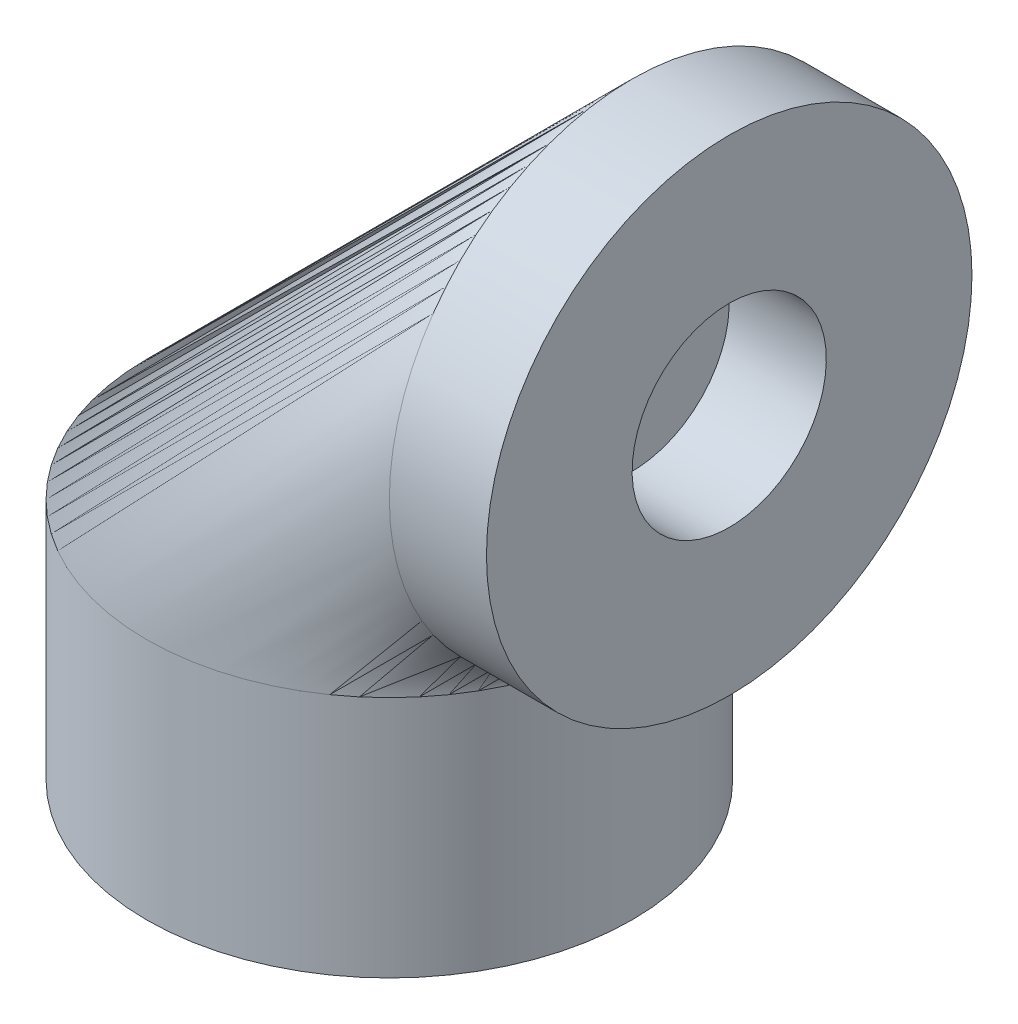
ISO-10303-21;
HEADER;
FILE_DESCRIPTION(('STEP AP214'),'2;1');
FILE_NAME('part.step','',(''),(''),'','','');
FILE_SCHEMA(('AUTOMOTIVE_DESIGN { 1 0 10303 214 1 1 1 1 }'));
ENDSEC;
DATA;
#1=APPLICATION_CONTEXT('core data for automotive mechanical design processes');
#2=APPLICATION_PROTOCOL_DEFINITION('international standard','automotive_design',2000,#1);
#3=PRODUCT_CONTEXT('',#1,'mechanical');
#4=PRODUCT('Part','Part','',(#3));
#5=PRODUCT_RELATED_PRODUCT_CATEGORY('part','',(#4));
#6=PRODUCT_DEFINITION_FORMATION('','',#4);
#7=PRODUCT_DEFINITION_CONTEXT('part definition',#1,'design');
#8=PRODUCT_DEFINITION('design','',#6,#7);
#9=PRODUCT_DEFINITION_SHAPE('','',#8);
#10=(LENGTH_UNIT() NAMED_UNIT(*) SI_UNIT(.MILLI.,.METRE.));
#11=(NAMED_UNIT(*) PLANE_ANGLE_UNIT() SI_UNIT($,.RADIAN.));
#12=(NAMED_UNIT(*) SI_UNIT($,.STERADIAN.) SOLID_ANGLE_UNIT());
#13=UNCERTAINTY_MEASURE_WITH_UNIT(LENGTH_MEASURE(1.E-05),#10,'distance_accuracy_value','');
#14=(GEOMETRIC_REPRESENTATION_CONTEXT(3) GLOBAL_UNCERTAINTY_ASSIGNED_CONTEXT((#13)) GLOBAL_UNIT_ASSIGNED_CONTEXT((#10,
#11,#12)) REPRESENTATION_CONTEXT('',''));
#15=CARTESIAN_POINT('',(0.,0.,0.));
#16=DIRECTION('',(0.,0.,1.));
#17=DIRECTION('',(1.,0.,0.));
#18=AXIS2_PLACEMENT_3D('',#15,#16,#17);
#19=CARTESIAN_POINT('',(0.,50.,0.));
#20=DIRECTION('',(0.,-1.,0.));
#21=DIRECTION('',(0.,0.,-1.));
#22=AXIS2_PLACEMENT_3D('',#19,#20,#21);
#23=CYLINDRICAL_SURFACE('',#22,50.);
#24=CARTESIAN_POINT('',(0.,50.,0.));
#25=DIRECTION('',(0.,1.,0.));
#26=DIRECTION('',(0.,0.,1.));
#27=AXIS2_PLACEMENT_3D('',#24,#25,#26);
#28=CIRCLE('',#27,50.);
#29=CARTESIAN_POINT('',(50.,50.,0.));
#30=VERTEX_POINT('',#29);
#31=EDGE_CURVE('E42',#30,#30,#28,.T.);
#32=ORIENTED_EDGE('',*,*,#31,.F.);
#33=EDGE_LOOP('',(#32));
#34=FACE_BOUND('',#33,.T.);
#35=CARTESIAN_POINT('',(0.,0.,0.));
#36=DIRECTION('',(0.,1.,0.));
#37=DIRECTION('',(0.,0.,1.));
#38=AXIS2_PLACEMENT_3D('',#35,#36,#37);
#39=CIRCLE('',#38,50.);
#40=CARTESIAN_POINT('',(0.,0.,50.));
#41=VERTEX_POINT('',#40);
#42=EDGE_CURVE('E52',#41,#41,#39,.T.);
#43=ORIENTED_EDGE('',*,*,#42,.T.);
#44=EDGE_LOOP('',(#43));
#45=FACE_BOUND('',#44,.T.);
#46=ADVANCED_FACE('F35',(#34,#45),#23,.T.);
#47=CARTESIAN_POINT('',(0.,0.,0.));
#48=DIRECTION('',(0.,1.,0.));
#49=DIRECTION('',(0.,0.,1.));
#50=AXIS2_PLACEMENT_3D('',#47,#48,#49);
#51=PLANE('',#50);
#52=CARTESIAN_POINT('',(0.,0.,0.));
#53=DIRECTION('',(0.,-1.,0.));
#54=DIRECTION('',(0.,0.,-1.));
#55=AXIS2_PLACEMENT_3D('',#52,#53,#54);
#56=CIRCLE('',#55,20.);
#57=CARTESIAN_POINT('',(0.,0.,-20.));
#58=VERTEX_POINT('',#57);
#59=EDGE_CURVE('E11',#58,#58,#56,.T.);
#60=ORIENTED_EDGE('',*,*,#59,.F.);
#61=EDGE_LOOP('',(#60));
#62=FACE_BOUND('',#61,.T.);
#63=ORIENTED_EDGE('',*,*,#42,.F.);
#64=EDGE_LOOP('',(#63));
#65=FACE_BOUND('',#64,.T.);
#66=ADVANCED_FACE('F83',(#62,#65),#51,.F.);
#67=CARTESIAN_POINT('',(50.,50.,0.));
#68=DIRECTION('',(0.,0.,1.));
#69=DIRECTION('',(1.,0.,0.));
#70=AXIS2_PLACEMENT_3D('',#67,#68,#69);
#71=DEGENERATE_TOROIDAL_SURFACE('',#70,50.,50.,.T.);
#72=ORIENTED_EDGE('',*,*,#31,.T.);
#73=CARTESIAN_POINT('',(50.,100.,0.));
#74=DIRECTION('',(1.,0.,0.));
#75=DIRECTION('',(0.,0.,1.));
#76=AXIS2_PLACEMENT_3D('',#73,#74,#75);
#77=CIRCLE('',#76,50.);
#78=EDGE_CURVE('E47',#30,#30,#77,.T.);
#79=ORIENTED_EDGE('',*,*,#78,.F.);
#80=EDGE_LOOP('',(#72,#79));
#81=FACE_BOUND('',#80,.T.);
#82=ADVANCED_FACE('F86',(#81),#71,.T.);
#83=CARTESIAN_POINT('',(70.,100.,0.));
#84=DIRECTION('',(-1.,0.,0.));
#85=DIRECTION('',(0.,-1.,0.));
#86=AXIS2_PLACEMENT_3D('',#83,#84,#85);
#87=CYLINDRICAL_SURFACE('',#86,50.);
#88=CARTESIAN_POINT('',(70.,100.,0.));
#89=DIRECTION('',(1.,0.,0.));
#90=DIRECTION('',(0.,1.,0.));
#91=AXIS2_PLACEMENT_3D('',#88,#89,#90);
#92=CIRCLE('',#91,50.);
#93=CARTESIAN_POINT('',(70.,150.,0.));
#94=VERTEX_POINT('',#93);
#95=EDGE_CURVE('E53',#94,#94,#92,.T.);
#96=ORIENTED_EDGE('',*,*,#95,.F.);
#97=EDGE_LOOP('',(#96));
#98=FACE_BOUND('',#97,.T.);
#99=ORIENTED_EDGE('',*,*,#78,.T.);
#100=EDGE_LOOP('',(#99));
#101=FACE_BOUND('',#100,.T.);
#102=ADVANCED_FACE('F49',(#98,#101),#87,.T.);
#103=CARTESIAN_POINT('',(70.,100.,0.));
#104=DIRECTION('',(1.,0.,0.));
#105=DIRECTION('',(0.,1.,0.));
#106=AXIS2_PLACEMENT_3D('',#103,#104,#105);
#107=PLANE('',#106);
#108=CARTESIAN_POINT('',(70.,100.,0.));
#109=DIRECTION('',(1.,0.,0.));
#110=DIRECTION('',(0.,1.,0.));
#111=AXIS2_PLACEMENT_3D('',#108,#109,#110);
#112=CIRCLE('',#111,20.);
#113=CARTESIAN_POINT('',(70.,120.,0.));
#114=VERTEX_POINT('',#113);
#115=EDGE_CURVE('E65',#114,#114,#112,.T.);
#116=ORIENTED_EDGE('',*,*,#115,.F.);
#117=EDGE_LOOP('',(#116));
#118=FACE_BOUND('',#117,.T.);
#119=ORIENTED_EDGE('',*,*,#95,.T.);
#120=EDGE_LOOP('',(#119));
#121=FACE_BOUND('',#120,.T.);
#122=ADVANCED_FACE('F109',(#118,#121),#107,.T.);
#123=CARTESIAN_POINT('',(50.,100.,0.));
#124=DIRECTION('',(1.,0.,0.));
#125=DIRECTION('',(0.,1.,0.));
#126=AXIS2_PLACEMENT_3D('',#123,#124,#125);
#127=CYLINDRICAL_SURFACE('',#126,20.);
#128=CARTESIAN_POINT('',(50.,100.,0.));
#129=DIRECTION('',(1.,0.,0.));
#130=DIRECTION('',(0.,1.,0.));
#131=AXIS2_PLACEMENT_3D('',#128,#129,#130);
#132=CIRCLE('',#131,20.);
#133=CARTESIAN_POINT('',(50.,120.,0.));
#134=VERTEX_POINT('',#133);
#135=EDGE_CURVE('E64',#134,#134,#132,.T.);
#136=ORIENTED_EDGE('',*,*,#135,.F.);
#137=EDGE_LOOP('',(#136));
#138=FACE_BOUND('',#137,.T.);
#139=ORIENTED_EDGE('',*,*,#115,.T.);
#140=EDGE_LOOP('',(#139));
#141=FACE_BOUND('',#140,.T.);
#142=ADVANCED_FACE('F117',(#138,#141),#127,.F.);
#143=CARTESIAN_POINT('',(50.,100.,0.));
#144=DIRECTION('',(1.,0.,0.));
#145=DIRECTION('',(0.,1.,0.));
#146=AXIS2_PLACEMENT_3D('',#143,#144,#145);
#147=PLANE('',#146);
#148=ORIENTED_EDGE('',*,*,#135,.T.);
#149=EDGE_LOOP('',(#148));
#150=FACE_BOUND('',#149,.T.);
#151=ADVANCED_FACE('F79',(#150),#147,.T.);
#152=CARTESIAN_POINT('',(0.,-20.,0.));
#153=DIRECTION('',(0.,1.,0.));
#154=DIRECTION('',(0.,0.,1.));
#155=AXIS2_PLACEMENT_3D('',#152,#153,#154);
#156=CYLINDRICAL_SURFACE('',#155,20.);
#157=CARTESIAN_POINT('',(0.,-20.,0.));
#158=DIRECTION('',(0.,-1.,0.));
#159=DIRECTION('',(0.,0.,-1.));
#160=AXIS2_PLACEMENT_3D('',#157,#158,#159);
#161=CIRCLE('',#160,20.);
#162=CARTESIAN_POINT('',(0.,-20.,-20.));
#163=VERTEX_POINT('',#162);
#164=EDGE_CURVE('E68',#163,#163,#161,.T.);
#165=ORIENTED_EDGE('',*,*,#164,.F.);
#166=EDGE_LOOP('',(#165));
#167=FACE_BOUND('',#166,.T.);
#168=ORIENTED_EDGE('',*,*,#59,.T.);
#169=EDGE_LOOP('',(#168));
#170=FACE_BOUND('',#169,.T.);
#171=ADVANCED_FACE('F76',(#167,#170),#156,.T.);
#172=CARTESIAN_POINT('',(0.,-20.,0.));
#173=DIRECTION('',(0.,-1.,0.));
#174=DIRECTION('',(0.,0.,-1.));
#175=AXIS2_PLACEMENT_3D('',#172,#173,#174);
#176=PLANE('',#175);
#177=ORIENTED_EDGE('',*,*,#164,.T.);
#178=EDGE_LOOP('',(#177));
#179=FACE_BOUND('',#178,.T.);
#180=ADVANCED_FACE('F74',(#179),#176,.T.);
#181=CLOSED_SHELL('',(#46,#66,#82,#102,#122,#142,#151,#171,#180));
#182=MANIFOLD_SOLID_BREP('B2',#181);
#183=ADVANCED_BREP_SHAPE_REPRESENTATION('',(#18,#182),#14);
#184=SHAPE_DEFINITION_REPRESENTATION(#9,#183);
ENDSEC;
END-ISO-10303-21;
